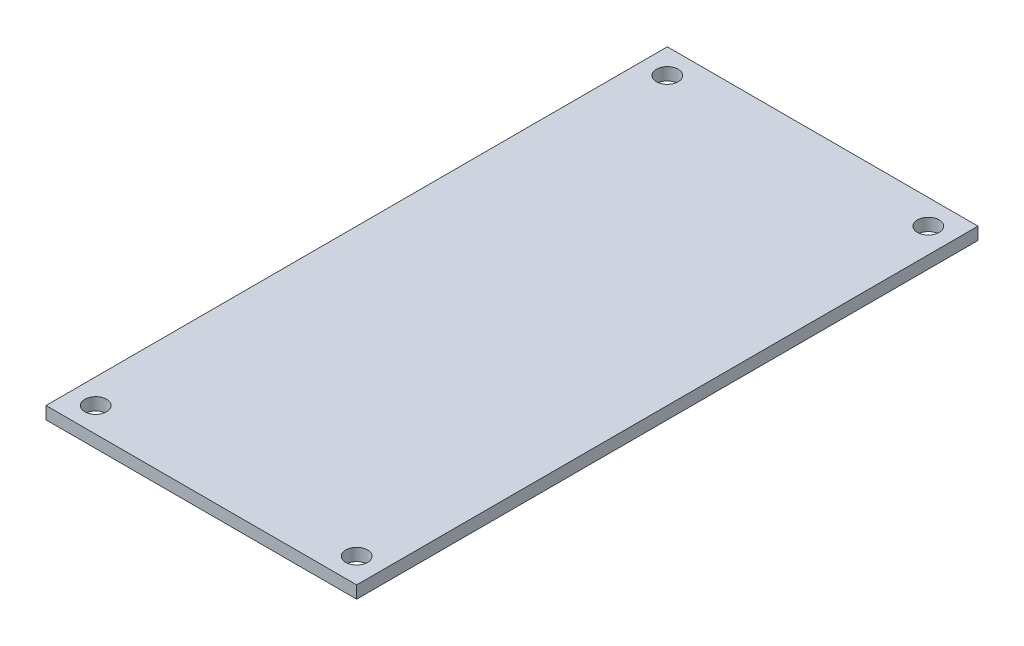
ISO-10303-21;
HEADER;
FILE_DESCRIPTION(('STEP AP214'),'2;1');
FILE_NAME('part.step','',(''),(''),'','','');
FILE_SCHEMA(('AUTOMOTIVE_DESIGN { 1 0 10303 214 1 1 1 1 }'));
ENDSEC;
DATA;
#1=APPLICATION_CONTEXT('core data for automotive mechanical design processes');
#2=APPLICATION_PROTOCOL_DEFINITION('international standard','automotive_design',2000,#1);
#3=PRODUCT_CONTEXT('',#1,'mechanical');
#4=PRODUCT('Part','Part','',(#3));
#5=PRODUCT_RELATED_PRODUCT_CATEGORY('part','',(#4));
#6=PRODUCT_DEFINITION_FORMATION('','',#4);
#7=PRODUCT_DEFINITION_CONTEXT('part definition',#1,'design');
#8=PRODUCT_DEFINITION('design','',#6,#7);
#9=PRODUCT_DEFINITION_SHAPE('','',#8);
#10=(LENGTH_UNIT() NAMED_UNIT(*) SI_UNIT(.MILLI.,.METRE.));
#11=(NAMED_UNIT(*) PLANE_ANGLE_UNIT() SI_UNIT($,.RADIAN.));
#12=(NAMED_UNIT(*) SI_UNIT($,.STERADIAN.) SOLID_ANGLE_UNIT());
#13=UNCERTAINTY_MEASURE_WITH_UNIT(LENGTH_MEASURE(1.E-05),#10,'distance_accuracy_value','');
#14=(GEOMETRIC_REPRESENTATION_CONTEXT(3) GLOBAL_UNCERTAINTY_ASSIGNED_CONTEXT((#13)) GLOBAL_UNIT_ASSIGNED_CONTEXT((#10,
#11,#12)) REPRESENTATION_CONTEXT('',''));
#15=CARTESIAN_POINT('',(0.,0.,0.));
#16=DIRECTION('',(0.,0.,1.));
#17=DIRECTION('',(1.,0.,0.));
#18=AXIS2_PLACEMENT_3D('',#15,#16,#17);
#19=CARTESIAN_POINT('',(0.,2.,0.));
#20=DIRECTION('',(0.,1.,0.));
#21=DIRECTION('',(0.,0.,1.));
#22=AXIS2_PLACEMENT_3D('',#19,#20,#21);
#23=PLANE('',#22);
#24=CARTESIAN_POINT('',(21.,2.,46.));
#25=DIRECTION('',(0.,1.,0.));
#26=DIRECTION('',(0.,0.,1.));
#27=AXIS2_PLACEMENT_3D('',#24,#25,#26);
#28=CIRCLE('',#27,1.75);
#29=CARTESIAN_POINT('',(21.,2.,47.75));
#30=VERTEX_POINT('',#29);
#31=EDGE_CURVE('E123',#30,#30,#28,.T.);
#32=ORIENTED_EDGE('',*,*,#31,.F.);
#33=EDGE_LOOP('',(#32));
#34=FACE_BOUND('',#33,.T.);
#35=CARTESIAN_POINT('',(-21.,2.,-46.));
#36=DIRECTION('',(0.,1.,0.));
#37=DIRECTION('',(0.,0.,1.));
#38=AXIS2_PLACEMENT_3D('',#35,#36,#37);
#39=CIRCLE('',#38,1.75);
#40=CARTESIAN_POINT('',(-21.,2.,-44.25));
#41=VERTEX_POINT('',#40);
#42=EDGE_CURVE('E102',#41,#41,#39,.T.);
#43=ORIENTED_EDGE('',*,*,#42,.F.);
#44=EDGE_LOOP('',(#43));
#45=FACE_BOUND('',#44,.T.);
#46=DIRECTION('',(0.,0.,1.));
#47=VECTOR('',#46,1.);
#48=CARTESIAN_POINT('',(-25.,2.,50.));
#49=LINE('',#48,#47);
#50=CARTESIAN_POINT('',(-25.,2.,-50.));
#51=VERTEX_POINT('',#50);
#52=CARTESIAN_POINT('',(-25.,2.,50.));
#53=VERTEX_POINT('',#52);
#54=EDGE_CURVE('E87',#51,#53,#49,.T.);
#55=ORIENTED_EDGE('',*,*,#54,.T.);
#56=DIRECTION('',(1.,0.,0.));
#57=VECTOR('',#56,1.);
#58=CARTESIAN_POINT('',(25.,2.,50.));
#59=LINE('',#58,#57);
#60=CARTESIAN_POINT('',(25.,2.,50.));
#61=VERTEX_POINT('',#60);
#62=EDGE_CURVE('E82',#53,#61,#59,.T.);
#63=ORIENTED_EDGE('',*,*,#62,.T.);
#64=DIRECTION('',(0.,0.,-1.));
#65=VECTOR('',#64,1.);
#66=CARTESIAN_POINT('',(25.,2.,50.));
#67=LINE('',#66,#65);
#68=CARTESIAN_POINT('',(25.,2.,-50.));
#69=VERTEX_POINT('',#68);
#70=EDGE_CURVE('E85',#61,#69,#67,.T.);
#71=ORIENTED_EDGE('',*,*,#70,.T.);
#72=DIRECTION('',(-1.,0.,0.));
#73=VECTOR('',#72,1.);
#74=CARTESIAN_POINT('',(25.,2.,-50.));
#75=LINE('',#74,#73);
#76=EDGE_CURVE('E52',#69,#51,#75,.T.);
#77=ORIENTED_EDGE('',*,*,#76,.T.);
#78=EDGE_LOOP('',(#55,#63,#71,#77));
#79=FACE_BOUND('',#78,.T.);
#80=CARTESIAN_POINT('',(21.,2.,-46.));
#81=DIRECTION('',(0.,1.,0.));
#82=DIRECTION('',(0.,0.,-1.));
#83=AXIS2_PLACEMENT_3D('',#80,#81,#82);
#84=CIRCLE('',#83,1.75);
#85=CARTESIAN_POINT('',(21.,2.,-47.75));
#86=VERTEX_POINT('',#85);
#87=EDGE_CURVE('E117',#86,#86,#84,.T.);
#88=ORIENTED_EDGE('',*,*,#87,.F.);
#89=EDGE_LOOP('',(#88));
#90=FACE_BOUND('',#89,.T.);
#91=CARTESIAN_POINT('',(-21.,2.,46.));
#92=DIRECTION('',(0.,1.,0.));
#93=DIRECTION('',(0.,0.,-1.));
#94=AXIS2_PLACEMENT_3D('',#91,#92,#93);
#95=CIRCLE('',#94,1.75);
#96=CARTESIAN_POINT('',(-21.,2.,44.25));
#97=VERTEX_POINT('',#96);
#98=EDGE_CURVE('E129',#97,#97,#95,.T.);
#99=ORIENTED_EDGE('',*,*,#98,.F.);
#100=EDGE_LOOP('',(#99));
#101=FACE_BOUND('',#100,.T.);
#102=ADVANCED_FACE('F35',(#34,#45,#79,#90,#101),#23,.T.);
#103=CARTESIAN_POINT('',(0.,0.,0.));
#104=DIRECTION('',(0.,1.,0.));
#105=DIRECTION('',(0.,0.,1.));
#106=AXIS2_PLACEMENT_3D('',#103,#104,#105);
#107=PLANE('',#106);
#108=DIRECTION('',(0.,0.,1.));
#109=VECTOR('',#108,1.);
#110=CARTESIAN_POINT('',(-25.,0.,50.));
#111=LINE('',#110,#109);
#112=CARTESIAN_POINT('',(-25.,0.,-50.));
#113=VERTEX_POINT('',#112);
#114=CARTESIAN_POINT('',(-25.,0.,50.));
#115=VERTEX_POINT('',#114);
#116=EDGE_CURVE('E99',#113,#115,#111,.T.);
#117=ORIENTED_EDGE('',*,*,#116,.F.);
#118=DIRECTION('',(-1.,0.,0.));
#119=VECTOR('',#118,1.);
#120=CARTESIAN_POINT('',(25.,0.,-50.));
#121=LINE('',#120,#119);
#122=CARTESIAN_POINT('',(25.,0.,-50.));
#123=VERTEX_POINT('',#122);
#124=EDGE_CURVE('E75',#123,#113,#121,.T.);
#125=ORIENTED_EDGE('',*,*,#124,.F.);
#126=DIRECTION('',(0.,0.,-1.));
#127=VECTOR('',#126,1.);
#128=CARTESIAN_POINT('',(25.,0.,50.));
#129=LINE('',#128,#127);
#130=CARTESIAN_POINT('',(25.,0.,50.));
#131=VERTEX_POINT('',#130);
#132=EDGE_CURVE('E69',#131,#123,#129,.T.);
#133=ORIENTED_EDGE('',*,*,#132,.F.);
#134=DIRECTION('',(1.,0.,0.));
#135=VECTOR('',#134,1.);
#136=CARTESIAN_POINT('',(25.,0.,50.));
#137=LINE('',#136,#135);
#138=EDGE_CURVE('E91',#115,#131,#137,.T.);
#139=ORIENTED_EDGE('',*,*,#138,.F.);
#140=EDGE_LOOP('',(#117,#125,#133,#139));
#141=FACE_BOUND('',#140,.T.);
#142=CARTESIAN_POINT('',(-21.,0.,-46.));
#143=DIRECTION('',(0.,1.,0.));
#144=DIRECTION('',(0.,0.,1.));
#145=AXIS2_PLACEMENT_3D('',#142,#143,#144);
#146=CIRCLE('',#145,1.75);
#147=CARTESIAN_POINT('',(-21.,0.,-44.25));
#148=VERTEX_POINT('',#147);
#149=EDGE_CURVE('E114',#148,#148,#146,.T.);
#150=ORIENTED_EDGE('',*,*,#149,.T.);
#151=EDGE_LOOP('',(#150));
#152=FACE_BOUND('',#151,.T.);
#153=CARTESIAN_POINT('',(21.,0.,-46.));
#154=DIRECTION('',(0.,1.,0.));
#155=DIRECTION('',(0.,0.,-1.));
#156=AXIS2_PLACEMENT_3D('',#153,#154,#155);
#157=CIRCLE('',#156,1.75);
#158=CARTESIAN_POINT('',(21.,0.,-47.75));
#159=VERTEX_POINT('',#158);
#160=EDGE_CURVE('E120',#159,#159,#157,.T.);
#161=ORIENTED_EDGE('',*,*,#160,.T.);
#162=EDGE_LOOP('',(#161));
#163=FACE_BOUND('',#162,.T.);
#164=CARTESIAN_POINT('',(21.,0.,46.));
#165=DIRECTION('',(0.,1.,0.));
#166=DIRECTION('',(0.,0.,1.));
#167=AXIS2_PLACEMENT_3D('',#164,#165,#166);
#168=CIRCLE('',#167,1.75);
#169=CARTESIAN_POINT('',(21.,0.,47.75));
#170=VERTEX_POINT('',#169);
#171=EDGE_CURVE('E126',#170,#170,#168,.T.);
#172=ORIENTED_EDGE('',*,*,#171,.T.);
#173=EDGE_LOOP('',(#172));
#174=FACE_BOUND('',#173,.T.);
#175=CARTESIAN_POINT('',(-21.,0.,46.));
#176=DIRECTION('',(0.,1.,0.));
#177=DIRECTION('',(0.,0.,-1.));
#178=AXIS2_PLACEMENT_3D('',#175,#176,#177);
#179=CIRCLE('',#178,1.75);
#180=CARTESIAN_POINT('',(-21.,0.,44.25));
#181=VERTEX_POINT('',#180);
#182=EDGE_CURVE('E132',#181,#181,#179,.T.);
#183=ORIENTED_EDGE('',*,*,#182,.T.);
#184=EDGE_LOOP('',(#183));
#185=FACE_BOUND('',#184,.T.);
#186=ADVANCED_FACE('F110',(#141,#152,#163,#174,#185),#107,.F.);
#187=CARTESIAN_POINT('',(-25.,2.,50.));
#188=DIRECTION('',(1.,0.,0.));
#189=DIRECTION('',(0.,0.,-1.));
#190=AXIS2_PLACEMENT_3D('',#187,#188,#189);
#191=PLANE('',#190);
#192=ORIENTED_EDGE('',*,*,#116,.T.);
#193=DIRECTION('',(0.,-1.,0.));
#194=VECTOR('',#193,1.);
#195=CARTESIAN_POINT('',(-25.,2.,50.));
#196=LINE('',#195,#194);
#197=EDGE_CURVE('E11',#53,#115,#196,.T.);
#198=ORIENTED_EDGE('',*,*,#197,.F.);
#199=ORIENTED_EDGE('',*,*,#54,.F.);
#200=DIRECTION('',(0.,-1.,0.));
#201=VECTOR('',#200,1.);
#202=CARTESIAN_POINT('',(-25.,2.,-50.));
#203=LINE('',#202,#201);
#204=EDGE_CURVE('E95',#51,#113,#203,.T.);
#205=ORIENTED_EDGE('',*,*,#204,.T.);
#206=EDGE_LOOP('',(#192,#198,#199,#205));
#207=FACE_BOUND('',#206,.T.);
#208=ADVANCED_FACE('F37',(#207),#191,.F.);
#209=CARTESIAN_POINT('',(25.,2.,50.));
#210=DIRECTION('',(0.,0.,-1.));
#211=DIRECTION('',(-1.,0.,0.));
#212=AXIS2_PLACEMENT_3D('',#209,#210,#211);
#213=PLANE('',#212);
#214=ORIENTED_EDGE('',*,*,#138,.T.);
#215=DIRECTION('',(0.,-1.,0.));
#216=VECTOR('',#215,1.);
#217=CARTESIAN_POINT('',(25.,2.,50.));
#218=LINE('',#217,#216);
#219=EDGE_CURVE('E44',#61,#131,#218,.T.);
#220=ORIENTED_EDGE('',*,*,#219,.F.);
#221=ORIENTED_EDGE('',*,*,#62,.F.);
#222=ORIENTED_EDGE('',*,*,#197,.T.);
#223=EDGE_LOOP('',(#214,#220,#221,#222));
#224=FACE_BOUND('',#223,.T.);
#225=ADVANCED_FACE('F90',(#224),#213,.F.);
#226=CARTESIAN_POINT('',(25.,2.,50.));
#227=DIRECTION('',(-1.,0.,0.));
#228=DIRECTION('',(0.,0.,1.));
#229=AXIS2_PLACEMENT_3D('',#226,#227,#228);
#230=PLANE('',#229);
#231=ORIENTED_EDGE('',*,*,#132,.T.);
#232=DIRECTION('',(0.,-1.,0.));
#233=VECTOR('',#232,1.);
#234=CARTESIAN_POINT('',(25.,2.,-50.));
#235=LINE('',#234,#233);
#236=EDGE_CURVE('E92',#69,#123,#235,.T.);
#237=ORIENTED_EDGE('',*,*,#236,.F.);
#238=ORIENTED_EDGE('',*,*,#70,.F.);
#239=ORIENTED_EDGE('',*,*,#219,.T.);
#240=EDGE_LOOP('',(#231,#237,#238,#239));
#241=FACE_BOUND('',#240,.T.);
#242=ADVANCED_FACE('F93',(#241),#230,.F.);
#243=CARTESIAN_POINT('',(25.,2.,-50.));
#244=DIRECTION('',(0.,0.,1.));
#245=DIRECTION('',(1.,0.,0.));
#246=AXIS2_PLACEMENT_3D('',#243,#244,#245);
#247=PLANE('',#246);
#248=ORIENTED_EDGE('',*,*,#124,.T.);
#249=ORIENTED_EDGE('',*,*,#204,.F.);
#250=ORIENTED_EDGE('',*,*,#76,.F.);
#251=ORIENTED_EDGE('',*,*,#236,.T.);
#252=EDGE_LOOP('',(#248,#249,#250,#251));
#253=FACE_BOUND('',#252,.T.);
#254=ADVANCED_FACE('F107',(#253),#247,.F.);
#255=CARTESIAN_POINT('',(-21.,2.,-46.));
#256=DIRECTION('',(0.,-1.,0.));
#257=DIRECTION('',(0.,0.,-1.));
#258=AXIS2_PLACEMENT_3D('',#255,#256,#257);
#259=CYLINDRICAL_SURFACE('',#258,1.75);
#260=ORIENTED_EDGE('',*,*,#42,.T.);
#261=EDGE_LOOP('',(#260));
#262=FACE_BOUND('',#261,.T.);
#263=ORIENTED_EDGE('',*,*,#149,.F.);
#264=EDGE_LOOP('',(#263));
#265=FACE_BOUND('',#264,.T.);
#266=ADVANCED_FACE('F151',(#262,#265),#259,.F.);
#267=CARTESIAN_POINT('',(21.,2.,-46.));
#268=DIRECTION('',(0.,-1.,0.));
#269=DIRECTION('',(0.,0.,-1.));
#270=AXIS2_PLACEMENT_3D('',#267,#268,#269);
#271=CYLINDRICAL_SURFACE('',#270,1.75);
#272=ORIENTED_EDGE('',*,*,#87,.T.);
#273=EDGE_LOOP('',(#272));
#274=FACE_BOUND('',#273,.T.);
#275=ORIENTED_EDGE('',*,*,#160,.F.);
#276=EDGE_LOOP('',(#275));
#277=FACE_BOUND('',#276,.T.);
#278=ADVANCED_FACE('F197',(#274,#277),#271,.F.);
#279=CARTESIAN_POINT('',(21.,2.,46.));
#280=DIRECTION('',(0.,-1.,0.));
#281=DIRECTION('',(0.,0.,-1.));
#282=AXIS2_PLACEMENT_3D('',#279,#280,#281);
#283=CYLINDRICAL_SURFACE('',#282,1.75);
#284=ORIENTED_EDGE('',*,*,#31,.T.);
#285=EDGE_LOOP('',(#284));
#286=FACE_BOUND('',#285,.T.);
#287=ORIENTED_EDGE('',*,*,#171,.F.);
#288=EDGE_LOOP('',(#287));
#289=FACE_BOUND('',#288,.T.);
#290=ADVANCED_FACE('F205',(#286,#289),#283,.F.);
#291=CARTESIAN_POINT('',(-21.,2.,46.));
#292=DIRECTION('',(0.,-1.,0.));
#293=DIRECTION('',(0.,0.,-1.));
#294=AXIS2_PLACEMENT_3D('',#291,#292,#293);
#295=CYLINDRICAL_SURFACE('',#294,1.75);
#296=ORIENTED_EDGE('',*,*,#98,.T.);
#297=EDGE_LOOP('',(#296));
#298=FACE_BOUND('',#297,.T.);
#299=ORIENTED_EDGE('',*,*,#182,.F.);
#300=EDGE_LOOP('',(#299));
#301=FACE_BOUND('',#300,.T.);
#302=ADVANCED_FACE('F138',(#298,#301),#295,.F.);
#303=CLOSED_SHELL('',(#102,#186,#208,#225,#242,#254,#266,#278,#290,#302));
#304=MANIFOLD_SOLID_BREP('B2',#303);
#305=ADVANCED_BREP_SHAPE_REPRESENTATION('',(#18,#304),#14);
#306=SHAPE_DEFINITION_REPRESENTATION(#9,#305);
ENDSEC;
END-ISO-10303-21;
